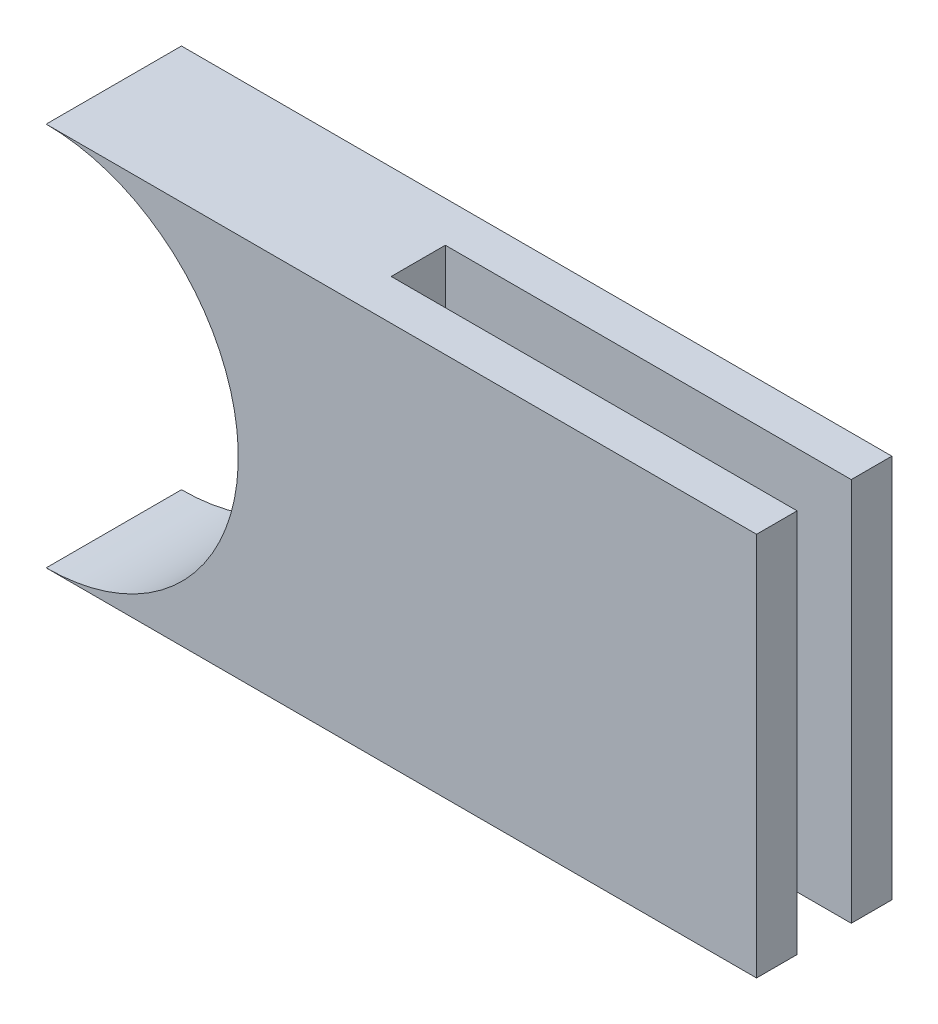
ISO-10303-21;
HEADER;
FILE_DESCRIPTION(('STEP AP214'),'2;1');
FILE_NAME('part.step','',(''),(''),'','','');
FILE_SCHEMA(('AUTOMOTIVE_DESIGN { 1 0 10303 214 1 1 1 1 }'));
ENDSEC;
DATA;
#1=APPLICATION_CONTEXT('core data for automotive mechanical design processes');
#2=APPLICATION_PROTOCOL_DEFINITION('international standard','automotive_design',2000,#1);
#3=PRODUCT_CONTEXT('',#1,'mechanical');
#4=PRODUCT('Part','Part','',(#3));
#5=PRODUCT_RELATED_PRODUCT_CATEGORY('part','',(#4));
#6=PRODUCT_DEFINITION_FORMATION('','',#4);
#7=PRODUCT_DEFINITION_CONTEXT('part definition',#1,'design');
#8=PRODUCT_DEFINITION('design','',#6,#7);
#9=PRODUCT_DEFINITION_SHAPE('','',#8);
#10=(LENGTH_UNIT() NAMED_UNIT(*) SI_UNIT(.MILLI.,.METRE.));
#11=(NAMED_UNIT(*) PLANE_ANGLE_UNIT() SI_UNIT($,.RADIAN.));
#12=(NAMED_UNIT(*) SI_UNIT($,.STERADIAN.) SOLID_ANGLE_UNIT());
#13=UNCERTAINTY_MEASURE_WITH_UNIT(LENGTH_MEASURE(1.E-05),#10,'distance_accuracy_value','');
#14=(GEOMETRIC_REPRESENTATION_CONTEXT(3) GLOBAL_UNCERTAINTY_ASSIGNED_CONTEXT((#13)) GLOBAL_UNIT_ASSIGNED_CONTEXT((#10,
#11,#12)) REPRESENTATION_CONTEXT('',''));
#15=CARTESIAN_POINT('',(0.,0.,0.));
#16=DIRECTION('',(0.,0.,1.));
#17=DIRECTION('',(1.,0.,0.));
#18=AXIS2_PLACEMENT_3D('',#15,#16,#17);
#19=CARTESIAN_POINT('',(66.675,18.034,0.));
#20=DIRECTION('',(1.,0.,0.));
#21=DIRECTION('',(0.,0.,-1.));
#22=AXIS2_PLACEMENT_3D('',#19,#20,#21);
#23=PLANE('',#22);
#24=DIRECTION('',(0.,-1.,0.));
#25=VECTOR('',#24,1.);
#26=CARTESIAN_POINT('',(66.675,-18.034,8.89));
#27=LINE('',#26,#25);
#28=CARTESIAN_POINT('',(66.675,18.034,8.89));
#29=VERTEX_POINT('',#28);
#30=CARTESIAN_POINT('',(66.675,-18.034,8.89));
#31=VERTEX_POINT('',#30);
#32=EDGE_CURVE('E172',#29,#31,#27,.T.);
#33=ORIENTED_EDGE('',*,*,#32,.F.);
#34=DIRECTION('',(0.,0.,1.));
#35=VECTOR('',#34,1.);
#36=CARTESIAN_POINT('',(66.675,18.034,0.));
#37=LINE('',#36,#35);
#38=CARTESIAN_POINT('',(66.675,18.034,12.7));
#39=VERTEX_POINT('',#38);
#40=EDGE_CURVE('E147',#29,#39,#37,.T.);
#41=ORIENTED_EDGE('',*,*,#40,.T.);
#42=DIRECTION('',(0.,1.,0.));
#43=VECTOR('',#42,1.);
#44=CARTESIAN_POINT('',(66.675,18.034,12.7));
#45=LINE('',#44,#43);
#46=CARTESIAN_POINT('',(66.675,-18.034,12.7));
#47=VERTEX_POINT('',#46);
#48=EDGE_CURVE('E137',#47,#39,#45,.T.);
#49=ORIENTED_EDGE('',*,*,#48,.F.);
#50=DIRECTION('',(0.,0.,1.));
#51=VECTOR('',#50,1.);
#52=CARTESIAN_POINT('',(66.675,-18.034,0.));
#53=LINE('',#52,#51);
#54=EDGE_CURVE('E149',#31,#47,#53,.T.);
#55=ORIENTED_EDGE('',*,*,#54,.F.);
#56=EDGE_LOOP('',(#33,#41,#49,#55));
#57=FACE_BOUND('',#56,.T.);
#58=ADVANCED_FACE('F36',(#57),#23,.T.);
#59=CARTESIAN_POINT('',(0.,0.,12.7));
#60=DIRECTION('',(0.,0.,1.));
#61=DIRECTION('',(1.,0.,0.));
#62=AXIS2_PLACEMENT_3D('',#59,#60,#61);
#63=PLANE('',#62);
#64=ORIENTED_EDGE('',*,*,#48,.T.);
#65=DIRECTION('',(-1.,0.,0.));
#66=VECTOR('',#65,1.);
#67=CARTESIAN_POINT('',(0.,18.034,12.7));
#68=LINE('',#67,#66);
#69=CARTESIAN_POINT('',(0.,18.034,12.7));
#70=VERTEX_POINT('',#69);
#71=EDGE_CURVE('E130',#39,#70,#68,.T.);
#72=ORIENTED_EDGE('',*,*,#71,.T.);
#73=CARTESIAN_POINT('',(0.,0.,12.7));
#74=DIRECTION('',(0.,0.,1.));
#75=DIRECTION('',(1.,0.,0.));
#76=AXIS2_PLACEMENT_3D('',#73,#74,#75);
#77=CIRCLE('',#76,18.034);
#78=CARTESIAN_POINT('',(0.,-18.034,12.7));
#79=VERTEX_POINT('',#78);
#80=EDGE_CURVE('E40',#79,#70,#77,.T.);
#81=ORIENTED_EDGE('',*,*,#80,.F.);
#82=DIRECTION('',(1.,0.,0.));
#83=VECTOR('',#82,1.);
#84=CARTESIAN_POINT('',(0.,-18.034,12.7));
#85=LINE('',#84,#83);
#86=EDGE_CURVE('E59',#79,#47,#85,.T.);
#87=ORIENTED_EDGE('',*,*,#86,.T.);
#88=EDGE_LOOP('',(#64,#72,#81,#87));
#89=FACE_BOUND('',#88,.T.);
#90=ADVANCED_FACE('F161',(#89),#63,.T.);
#91=CARTESIAN_POINT('',(0.,0.,0.));
#92=DIRECTION('',(0.,0.,1.));
#93=DIRECTION('',(1.,0.,0.));
#94=AXIS2_PLACEMENT_3D('',#91,#92,#93);
#95=PLANE('',#94);
#96=DIRECTION('',(-1.,0.,0.));
#97=VECTOR('',#96,1.);
#98=CARTESIAN_POINT('',(0.,18.034,0.));
#99=LINE('',#98,#97);
#100=CARTESIAN_POINT('',(66.675,18.034,0.));
#101=VERTEX_POINT('',#100);
#102=CARTESIAN_POINT('',(0.,18.034,0.));
#103=VERTEX_POINT('',#102);
#104=EDGE_CURVE('E133',#101,#103,#99,.T.);
#105=ORIENTED_EDGE('',*,*,#104,.F.);
#106=DIRECTION('',(0.,1.,0.));
#107=VECTOR('',#106,1.);
#108=CARTESIAN_POINT('',(66.675,18.034,0.));
#109=LINE('',#108,#107);
#110=CARTESIAN_POINT('',(66.675,-18.034,0.));
#111=VERTEX_POINT('',#110);
#112=EDGE_CURVE('E129',#111,#101,#109,.T.);
#113=ORIENTED_EDGE('',*,*,#112,.F.);
#114=DIRECTION('',(1.,0.,0.));
#115=VECTOR('',#114,1.);
#116=CARTESIAN_POINT('',(0.,-18.034,0.));
#117=LINE('',#116,#115);
#118=CARTESIAN_POINT('',(0.,-18.034,0.));
#119=VERTEX_POINT('',#118);
#120=EDGE_CURVE('E127',#119,#111,#117,.T.);
#121=ORIENTED_EDGE('',*,*,#120,.F.);
#122=CARTESIAN_POINT('',(0.,0.,0.));
#123=DIRECTION('',(0.,0.,1.));
#124=DIRECTION('',(1.,0.,0.));
#125=AXIS2_PLACEMENT_3D('',#122,#123,#124);
#126=CIRCLE('',#125,18.034);
#127=EDGE_CURVE('E12',#119,#103,#126,.T.);
#128=ORIENTED_EDGE('',*,*,#127,.T.);
#129=EDGE_LOOP('',(#105,#113,#121,#128));
#130=FACE_BOUND('',#129,.T.);
#131=ADVANCED_FACE('F38',(#130),#95,.F.);
#132=CARTESIAN_POINT('',(0.,0.,0.));
#133=DIRECTION('',(0.,0.,1.));
#134=DIRECTION('',(1.,0.,0.));
#135=AXIS2_PLACEMENT_3D('',#132,#133,#134);
#136=CYLINDRICAL_SURFACE('',#135,18.034);
#137=ORIENTED_EDGE('',*,*,#80,.T.);
#138=DIRECTION('',(0.,0.,1.));
#139=VECTOR('',#138,1.);
#140=CARTESIAN_POINT('',(0.,18.034,0.));
#141=LINE('',#140,#139);
#142=EDGE_CURVE('E142',#103,#70,#141,.T.);
#143=ORIENTED_EDGE('',*,*,#142,.F.);
#144=ORIENTED_EDGE('',*,*,#127,.F.);
#145=DIRECTION('',(0.,0.,1.));
#146=VECTOR('',#145,1.);
#147=CARTESIAN_POINT('',(0.,-18.034,0.));
#148=LINE('',#147,#146);
#149=EDGE_CURVE('E135',#119,#79,#148,.T.);
#150=ORIENTED_EDGE('',*,*,#149,.T.);
#151=EDGE_LOOP('',(#137,#143,#144,#150));
#152=FACE_BOUND('',#151,.T.);
#153=ADVANCED_FACE('F163',(#152),#136,.F.);
#154=CARTESIAN_POINT('',(0.,18.034,0.));
#155=DIRECTION('',(0.,1.,0.));
#156=DIRECTION('',(0.,0.,1.));
#157=AXIS2_PLACEMENT_3D('',#154,#155,#156);
#158=PLANE('',#157);
#159=DIRECTION('',(1.,0.,0.));
#160=VECTOR('',#159,1.);
#161=CARTESIAN_POINT('',(28.575,18.034,8.89));
#162=LINE('',#161,#160);
#163=CARTESIAN_POINT('',(28.575,18.034,8.89));
#164=VERTEX_POINT('',#163);
#165=EDGE_CURVE('E122',#164,#29,#162,.T.);
#166=ORIENTED_EDGE('',*,*,#165,.F.);
#167=DIRECTION('',(0.,0.,1.));
#168=VECTOR('',#167,1.);
#169=CARTESIAN_POINT('',(28.575,18.034,3.81));
#170=LINE('',#169,#168);
#171=CARTESIAN_POINT('',(28.575,18.034,3.81));
#172=VERTEX_POINT('',#171);
#173=EDGE_CURVE('E109',#172,#164,#170,.T.);
#174=ORIENTED_EDGE('',*,*,#173,.F.);
#175=DIRECTION('',(1.,0.,0.));
#176=VECTOR('',#175,1.);
#177=CARTESIAN_POINT('',(28.575,18.034,3.81));
#178=LINE('',#177,#176);
#179=CARTESIAN_POINT('',(66.675,18.034,3.81));
#180=VERTEX_POINT('',#179);
#181=EDGE_CURVE('E107',#172,#180,#178,.T.);
#182=ORIENTED_EDGE('',*,*,#181,.T.);
#183=EDGE_CURVE('E144',#101,#180,#37,.T.);
#184=ORIENTED_EDGE('',*,*,#183,.F.);
#185=ORIENTED_EDGE('',*,*,#104,.T.);
#186=ORIENTED_EDGE('',*,*,#142,.T.);
#187=ORIENTED_EDGE('',*,*,#71,.F.);
#188=ORIENTED_EDGE('',*,*,#40,.F.);
#189=EDGE_LOOP('',(#166,#174,#182,#184,#185,#186,#187,#188));
#190=FACE_BOUND('',#189,.T.);
#191=ADVANCED_FACE('F181',(#190),#158,.T.);
#192=DIRECTION('',(0.,1.,0.));
#193=VECTOR('',#192,1.);
#194=CARTESIAN_POINT('',(66.675,-18.034,3.81));
#195=LINE('',#194,#193);
#196=CARTESIAN_POINT('',(66.675,-18.034,3.81));
#197=VERTEX_POINT('',#196);
#198=EDGE_CURVE('E171',#197,#180,#195,.T.);
#199=ORIENTED_EDGE('',*,*,#198,.F.);
#200=EDGE_CURVE('E119',#111,#197,#53,.T.);
#201=ORIENTED_EDGE('',*,*,#200,.F.);
#202=ORIENTED_EDGE('',*,*,#112,.T.);
#203=ORIENTED_EDGE('',*,*,#183,.T.);
#204=EDGE_LOOP('',(#199,#201,#202,#203));
#205=FACE_BOUND('',#204,.T.);
#206=ADVANCED_FACE('F170',(#205),#23,.T.);
#207=CARTESIAN_POINT('',(0.,-18.034,0.));
#208=DIRECTION('',(0.,-1.,0.));
#209=DIRECTION('',(0.,0.,-1.));
#210=AXIS2_PLACEMENT_3D('',#207,#208,#209);
#211=PLANE('',#210);
#212=DIRECTION('',(1.,0.,0.));
#213=VECTOR('',#212,1.);
#214=CARTESIAN_POINT('',(28.575,-18.034,8.89));
#215=LINE('',#214,#213);
#216=CARTESIAN_POINT('',(28.575,-18.034,8.89));
#217=VERTEX_POINT('',#216);
#218=EDGE_CURVE('E120',#217,#31,#215,.T.);
#219=ORIENTED_EDGE('',*,*,#218,.T.);
#220=ORIENTED_EDGE('',*,*,#54,.T.);
#221=ORIENTED_EDGE('',*,*,#86,.F.);
#222=ORIENTED_EDGE('',*,*,#149,.F.);
#223=ORIENTED_EDGE('',*,*,#120,.T.);
#224=ORIENTED_EDGE('',*,*,#200,.T.);
#225=DIRECTION('',(1.,0.,0.));
#226=VECTOR('',#225,1.);
#227=CARTESIAN_POINT('',(28.575,-18.034,3.81));
#228=LINE('',#227,#226);
#229=CARTESIAN_POINT('',(28.575,-18.034,3.81));
#230=VERTEX_POINT('',#229);
#231=EDGE_CURVE('E104',#230,#197,#228,.T.);
#232=ORIENTED_EDGE('',*,*,#231,.F.);
#233=DIRECTION('',(0.,0.,-1.));
#234=VECTOR('',#233,1.);
#235=CARTESIAN_POINT('',(28.575,-18.034,3.81));
#236=LINE('',#235,#234);
#237=EDGE_CURVE('E110',#217,#230,#236,.T.);
#238=ORIENTED_EDGE('',*,*,#237,.F.);
#239=EDGE_LOOP('',(#219,#220,#221,#222,#223,#224,#232,#238));
#240=FACE_BOUND('',#239,.T.);
#241=ADVANCED_FACE('F117',(#240),#211,.T.);
#242=CARTESIAN_POINT('',(28.575,-18.034,8.89));
#243=DIRECTION('',(0.,0.,1.));
#244=DIRECTION('',(1.,0.,0.));
#245=AXIS2_PLACEMENT_3D('',#242,#243,#244);
#246=PLANE('',#245);
#247=ORIENTED_EDGE('',*,*,#32,.T.);
#248=ORIENTED_EDGE('',*,*,#218,.F.);
#249=DIRECTION('',(0.,-1.,0.));
#250=VECTOR('',#249,1.);
#251=CARTESIAN_POINT('',(28.575,-18.034,8.89));
#252=LINE('',#251,#250);
#253=EDGE_CURVE('E51',#164,#217,#252,.T.);
#254=ORIENTED_EDGE('',*,*,#253,.F.);
#255=ORIENTED_EDGE('',*,*,#165,.T.);
#256=EDGE_LOOP('',(#247,#248,#254,#255));
#257=FACE_BOUND('',#256,.T.);
#258=ADVANCED_FACE('F180',(#257),#246,.F.);
#259=CARTESIAN_POINT('',(28.575,-18.034,3.81));
#260=DIRECTION('',(0.,0.,-1.));
#261=DIRECTION('',(-1.,0.,0.));
#262=AXIS2_PLACEMENT_3D('',#259,#260,#261);
#263=PLANE('',#262);
#264=ORIENTED_EDGE('',*,*,#198,.T.);
#265=ORIENTED_EDGE('',*,*,#181,.F.);
#266=DIRECTION('',(0.,1.,0.));
#267=VECTOR('',#266,1.);
#268=CARTESIAN_POINT('',(28.575,-18.034,3.81));
#269=LINE('',#268,#267);
#270=EDGE_CURVE('E101',#230,#172,#269,.T.);
#271=ORIENTED_EDGE('',*,*,#270,.F.);
#272=ORIENTED_EDGE('',*,*,#231,.T.);
#273=EDGE_LOOP('',(#264,#265,#271,#272));
#274=FACE_BOUND('',#273,.T.);
#275=ADVANCED_FACE('F102',(#274),#263,.F.);
#276=CARTESIAN_POINT('',(28.575,0.,0.));
#277=DIRECTION('',(1.,0.,0.));
#278=DIRECTION('',(0.,0.,-1.));
#279=AXIS2_PLACEMENT_3D('',#276,#277,#278);
#280=PLANE('',#279);
#281=CARTESIAN_POINT('',(28.575,0.,6.35));
#282=DIRECTION('',(1.,0.,0.));
#283=DIRECTION('',(0.,0.,-1.));
#284=AXIS2_PLACEMENT_3D('',#281,#282,#283);
#285=CIRCLE('',#284,1.905);
#286=CARTESIAN_POINT('',(28.575,0.,4.445));
#287=VERTEX_POINT('',#286);
#288=EDGE_CURVE('E219',#287,#287,#285,.T.);
#289=ORIENTED_EDGE('',*,*,#288,.F.);
#290=EDGE_LOOP('',(#289));
#291=FACE_BOUND('',#290,.T.);
#292=ORIENTED_EDGE('',*,*,#253,.T.);
#293=ORIENTED_EDGE('',*,*,#237,.T.);
#294=ORIENTED_EDGE('',*,*,#270,.T.);
#295=ORIENTED_EDGE('',*,*,#173,.T.);
#296=EDGE_LOOP('',(#292,#293,#294,#295));
#297=FACE_BOUND('',#296,.T.);
#298=ADVANCED_FACE('F113',(#291,#297),#280,.T.);
#299=CARTESIAN_POINT('',(31.115,0.,6.35));
#300=DIRECTION('',(-1.,0.,0.));
#301=DIRECTION('',(0.,0.,1.));
#302=AXIS2_PLACEMENT_3D('',#299,#300,#301);
#303=CYLINDRICAL_SURFACE('',#302,1.905);
#304=CARTESIAN_POINT('',(31.115,0.,6.35));
#305=DIRECTION('',(1.,0.,0.));
#306=DIRECTION('',(0.,0.,-1.));
#307=AXIS2_PLACEMENT_3D('',#304,#305,#306);
#308=CIRCLE('',#307,1.905);
#309=CARTESIAN_POINT('',(31.115,0.,4.445));
#310=VERTEX_POINT('',#309);
#311=EDGE_CURVE('E175',#310,#310,#308,.T.);
#312=ORIENTED_EDGE('',*,*,#311,.F.);
#313=EDGE_LOOP('',(#312));
#314=FACE_BOUND('',#313,.T.);
#315=ORIENTED_EDGE('',*,*,#288,.T.);
#316=EDGE_LOOP('',(#315));
#317=FACE_BOUND('',#316,.T.);
#318=ADVANCED_FACE('F207',(#314,#317),#303,.T.);
#319=CARTESIAN_POINT('',(31.115,0.,6.35));
#320=DIRECTION('',(1.,0.,0.));
#321=DIRECTION('',(0.,0.,-1.));
#322=AXIS2_PLACEMENT_3D('',#319,#320,#321);
#323=PLANE('',#322);
#324=ORIENTED_EDGE('',*,*,#311,.T.);
#325=EDGE_LOOP('',(#324));
#326=FACE_BOUND('',#325,.T.);
#327=ADVANCED_FACE('F211',(#326),#323,.T.);
#328=CLOSED_SHELL('',(#58,#90,#131,#153,#191,#206,#241,#258,#275,#298,#318,#327));
#329=MANIFOLD_SOLID_BREP('B2',#328);
#330=ADVANCED_BREP_SHAPE_REPRESENTATION('',(#18,#329),#14);
#331=SHAPE_DEFINITION_REPRESENTATION(#9,#330);
ENDSEC;
END-ISO-10303-21;
